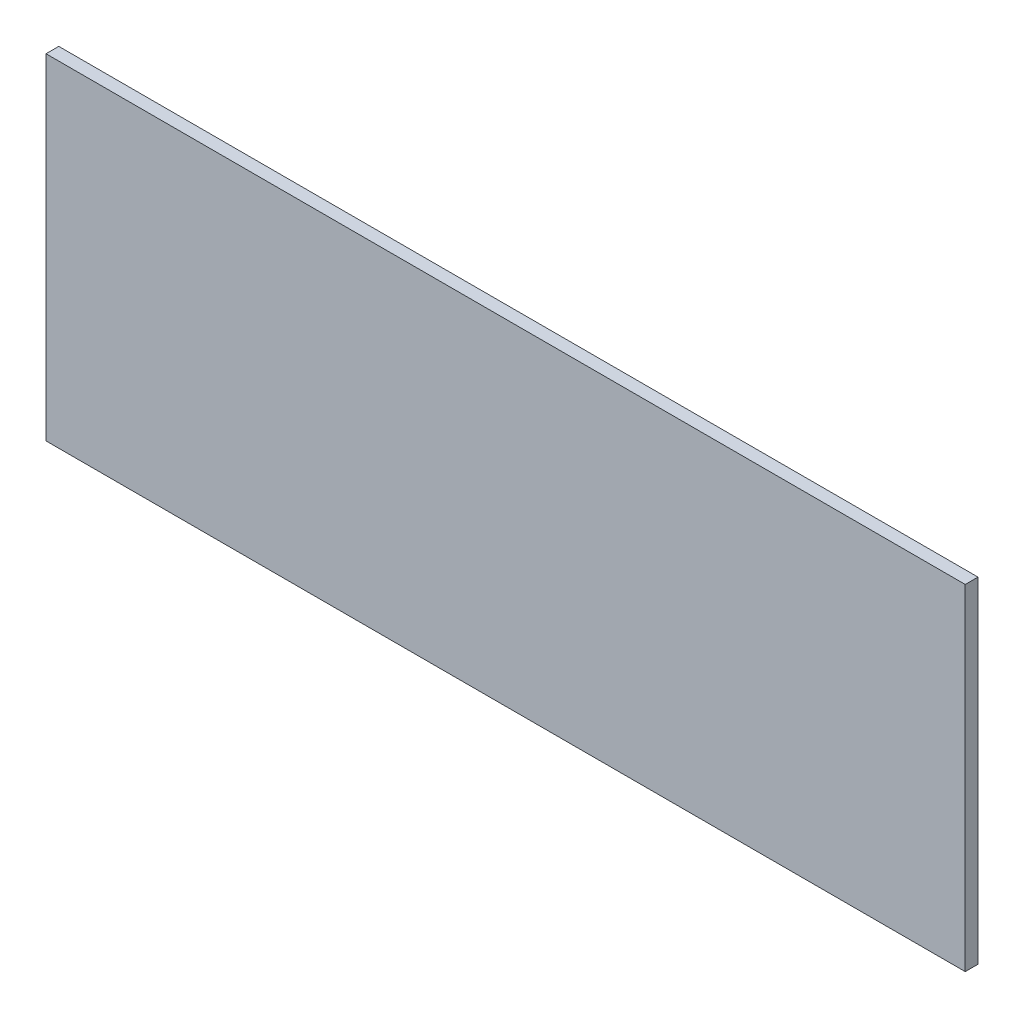
ISO-10303-21;
HEADER;
FILE_DESCRIPTION(('STEP AP214'),'2;1');
FILE_NAME('part.step','',(''),(''),'','','');
FILE_SCHEMA(('AUTOMOTIVE_DESIGN { 1 0 10303 214 1 1 1 1 }'));
ENDSEC;
DATA;
#1=APPLICATION_CONTEXT('core data for automotive mechanical design processes');
#2=APPLICATION_PROTOCOL_DEFINITION('international standard','automotive_design',2000,#1);
#3=PRODUCT_CONTEXT('',#1,'mechanical');
#4=PRODUCT('Part','Part','',(#3));
#5=PRODUCT_RELATED_PRODUCT_CATEGORY('part','',(#4));
#6=PRODUCT_DEFINITION_FORMATION('','',#4);
#7=PRODUCT_DEFINITION_CONTEXT('part definition',#1,'design');
#8=PRODUCT_DEFINITION('design','',#6,#7);
#9=PRODUCT_DEFINITION_SHAPE('','',#8);
#10=(LENGTH_UNIT() NAMED_UNIT(*) SI_UNIT(.MILLI.,.METRE.));
#11=(NAMED_UNIT(*) PLANE_ANGLE_UNIT() SI_UNIT($,.RADIAN.));
#12=(NAMED_UNIT(*) SI_UNIT($,.STERADIAN.) SOLID_ANGLE_UNIT());
#13=UNCERTAINTY_MEASURE_WITH_UNIT(LENGTH_MEASURE(1.E-05),#10,'distance_accuracy_value','');
#14=(GEOMETRIC_REPRESENTATION_CONTEXT(3) GLOBAL_UNCERTAINTY_ASSIGNED_CONTEXT((#13)) GLOBAL_UNIT_ASSIGNED_CONTEXT((#10,
#11,#12)) REPRESENTATION_CONTEXT('',''));
#15=CARTESIAN_POINT('',(0.,0.,0.));
#16=DIRECTION('',(0.,0.,1.));
#17=DIRECTION('',(1.,0.,0.));
#18=AXIS2_PLACEMENT_3D('',#15,#16,#17);
#19=CARTESIAN_POINT('',(0.,0.,3.175));
#20=DIRECTION('',(1.,0.,0.));
#21=DIRECTION('',(0.,0.,-1.));
#22=AXIS2_PLACEMENT_3D('',#19,#20,#21);
#23=PLANE('',#22);
#24=DIRECTION('',(0.,-1.,0.));
#25=VECTOR('',#24,1.);
#26=CARTESIAN_POINT('',(0.,0.,0.));
#27=LINE('',#26,#25);
#28=CARTESIAN_POINT('',(0.,83.3882,0.));
#29=VERTEX_POINT('',#28);
#30=CARTESIAN_POINT('',(0.,0.,0.));
#31=VERTEX_POINT('',#30);
#32=EDGE_CURVE('E97',#29,#31,#27,.T.);
#33=ORIENTED_EDGE('',*,*,#32,.T.);
#34=DIRECTION('',(0.,0.,-1.));
#35=VECTOR('',#34,1.);
#36=CARTESIAN_POINT('',(0.,0.,3.175));
#37=LINE('',#36,#35);
#38=CARTESIAN_POINT('',(0.,0.,3.175));
#39=VERTEX_POINT('',#38);
#40=EDGE_CURVE('E11',#39,#31,#37,.T.);
#41=ORIENTED_EDGE('',*,*,#40,.F.);
#42=DIRECTION('',(0.,-1.,0.));
#43=VECTOR('',#42,1.);
#44=CARTESIAN_POINT('',(0.,0.,3.175));
#45=LINE('',#44,#43);
#46=CARTESIAN_POINT('',(0.,83.3882,3.175));
#47=VERTEX_POINT('',#46);
#48=EDGE_CURVE('E85',#47,#39,#45,.T.);
#49=ORIENTED_EDGE('',*,*,#48,.F.);
#50=DIRECTION('',(0.,0.,-1.));
#51=VECTOR('',#50,1.);
#52=CARTESIAN_POINT('',(0.,83.3882,3.175));
#53=LINE('',#52,#51);
#54=EDGE_CURVE('E93',#47,#29,#53,.T.);
#55=ORIENTED_EDGE('',*,*,#54,.T.);
#56=EDGE_LOOP('',(#33,#41,#49,#55));
#57=FACE_BOUND('',#56,.T.);
#58=ADVANCED_FACE('F34',(#57),#23,.F.);
#59=CARTESIAN_POINT('',(0.,0.,3.175));
#60=DIRECTION('',(0.,1.,0.));
#61=DIRECTION('',(0.,0.,1.));
#62=AXIS2_PLACEMENT_3D('',#59,#60,#61);
#63=PLANE('',#62);
#64=DIRECTION('',(1.,0.,0.));
#65=VECTOR('',#64,1.);
#66=CARTESIAN_POINT('',(0.,0.,0.));
#67=LINE('',#66,#65);
#68=CARTESIAN_POINT('',(228.6,0.,0.));
#69=VERTEX_POINT('',#68);
#70=EDGE_CURVE('E89',#31,#69,#67,.T.);
#71=ORIENTED_EDGE('',*,*,#70,.T.);
#72=DIRECTION('',(0.,0.,-1.));
#73=VECTOR('',#72,1.);
#74=CARTESIAN_POINT('',(228.6,0.,3.175));
#75=LINE('',#74,#73);
#76=CARTESIAN_POINT('',(228.6,0.,3.175));
#77=VERTEX_POINT('',#76);
#78=EDGE_CURVE('E42',#77,#69,#75,.T.);
#79=ORIENTED_EDGE('',*,*,#78,.F.);
#80=DIRECTION('',(1.,0.,0.));
#81=VECTOR('',#80,1.);
#82=CARTESIAN_POINT('',(0.,0.,3.175));
#83=LINE('',#82,#81);
#84=EDGE_CURVE('E80',#39,#77,#83,.T.);
#85=ORIENTED_EDGE('',*,*,#84,.F.);
#86=ORIENTED_EDGE('',*,*,#40,.T.);
#87=EDGE_LOOP('',(#71,#79,#85,#86));
#88=FACE_BOUND('',#87,.T.);
#89=ADVANCED_FACE('F88',(#88),#63,.F.);
#90=CARTESIAN_POINT('',(228.6,0.,3.175));
#91=DIRECTION('',(-1.,0.,0.));
#92=DIRECTION('',(0.,0.,1.));
#93=AXIS2_PLACEMENT_3D('',#90,#91,#92);
#94=PLANE('',#93);
#95=DIRECTION('',(0.,1.,0.));
#96=VECTOR('',#95,1.);
#97=CARTESIAN_POINT('',(228.6,0.,0.));
#98=LINE('',#97,#96);
#99=CARTESIAN_POINT('',(228.6,83.3882,0.));
#100=VERTEX_POINT('',#99);
#101=EDGE_CURVE('E67',#69,#100,#98,.T.);
#102=ORIENTED_EDGE('',*,*,#101,.T.);
#103=DIRECTION('',(0.,0.,-1.));
#104=VECTOR('',#103,1.);
#105=CARTESIAN_POINT('',(228.6,83.3882,3.175));
#106=LINE('',#105,#104);
#107=CARTESIAN_POINT('',(228.6,83.3882,3.175));
#108=VERTEX_POINT('',#107);
#109=EDGE_CURVE('E90',#108,#100,#106,.T.);
#110=ORIENTED_EDGE('',*,*,#109,.F.);
#111=DIRECTION('',(0.,1.,0.));
#112=VECTOR('',#111,1.);
#113=CARTESIAN_POINT('',(228.6,0.,3.175));
#114=LINE('',#113,#112);
#115=EDGE_CURVE('E83',#77,#108,#114,.T.);
#116=ORIENTED_EDGE('',*,*,#115,.F.);
#117=ORIENTED_EDGE('',*,*,#78,.T.);
#118=EDGE_LOOP('',(#102,#110,#116,#117));
#119=FACE_BOUND('',#118,.T.);
#120=ADVANCED_FACE('F91',(#119),#94,.F.);
#121=CARTESIAN_POINT('',(0.,83.3882,3.175));
#122=DIRECTION('',(0.,-1.,0.));
#123=DIRECTION('',(0.,0.,-1.));
#124=AXIS2_PLACEMENT_3D('',#121,#122,#123);
#125=PLANE('',#124);
#126=DIRECTION('',(-1.,0.,0.));
#127=VECTOR('',#126,1.);
#128=CARTESIAN_POINT('',(0.,83.3882,0.));
#129=LINE('',#128,#127);
#130=EDGE_CURVE('E73',#100,#29,#129,.T.);
#131=ORIENTED_EDGE('',*,*,#130,.T.);
#132=ORIENTED_EDGE('',*,*,#54,.F.);
#133=DIRECTION('',(-1.,0.,0.));
#134=VECTOR('',#133,1.);
#135=CARTESIAN_POINT('',(0.,83.3882,3.175));
#136=LINE('',#135,#134);
#137=EDGE_CURVE('E50',#108,#47,#136,.T.);
#138=ORIENTED_EDGE('',*,*,#137,.F.);
#139=ORIENTED_EDGE('',*,*,#109,.T.);
#140=EDGE_LOOP('',(#131,#132,#138,#139));
#141=FACE_BOUND('',#140,.T.);
#142=ADVANCED_FACE('F104',(#141),#125,.F.);
#143=CARTESIAN_POINT('',(0.,0.,3.175));
#144=DIRECTION('',(0.,0.,-1.));
#145=DIRECTION('',(-1.,0.,0.));
#146=AXIS2_PLACEMENT_3D('',#143,#144,#145);
#147=PLANE('',#146);
#148=ORIENTED_EDGE('',*,*,#48,.T.);
#149=ORIENTED_EDGE('',*,*,#84,.T.);
#150=ORIENTED_EDGE('',*,*,#115,.T.);
#151=ORIENTED_EDGE('',*,*,#137,.T.);
#152=EDGE_LOOP('',(#148,#149,#150,#151));
#153=FACE_BOUND('',#152,.T.);
#154=ADVANCED_FACE('F81',(#153),#147,.F.);
#155=CARTESIAN_POINT('',(0.,0.,0.));
#156=DIRECTION('',(0.,0.,-1.));
#157=DIRECTION('',(-1.,0.,0.));
#158=AXIS2_PLACEMENT_3D('',#155,#156,#157);
#159=PLANE('',#158);
#160=ORIENTED_EDGE('',*,*,#32,.F.);
#161=ORIENTED_EDGE('',*,*,#130,.F.);
#162=ORIENTED_EDGE('',*,*,#101,.F.);
#163=ORIENTED_EDGE('',*,*,#70,.F.);
#164=EDGE_LOOP('',(#160,#161,#162,#163));
#165=FACE_BOUND('',#164,.T.);
#166=ADVANCED_FACE('F107',(#165),#159,.T.);
#167=CLOSED_SHELL('',(#58,#89,#120,#142,#154,#166));
#168=MANIFOLD_SOLID_BREP('B2',#167);
#169=ADVANCED_BREP_SHAPE_REPRESENTATION('',(#18,#168),#14);
#170=SHAPE_DEFINITION_REPRESENTATION(#9,#169);
ENDSEC;
END-ISO-10303-21;
